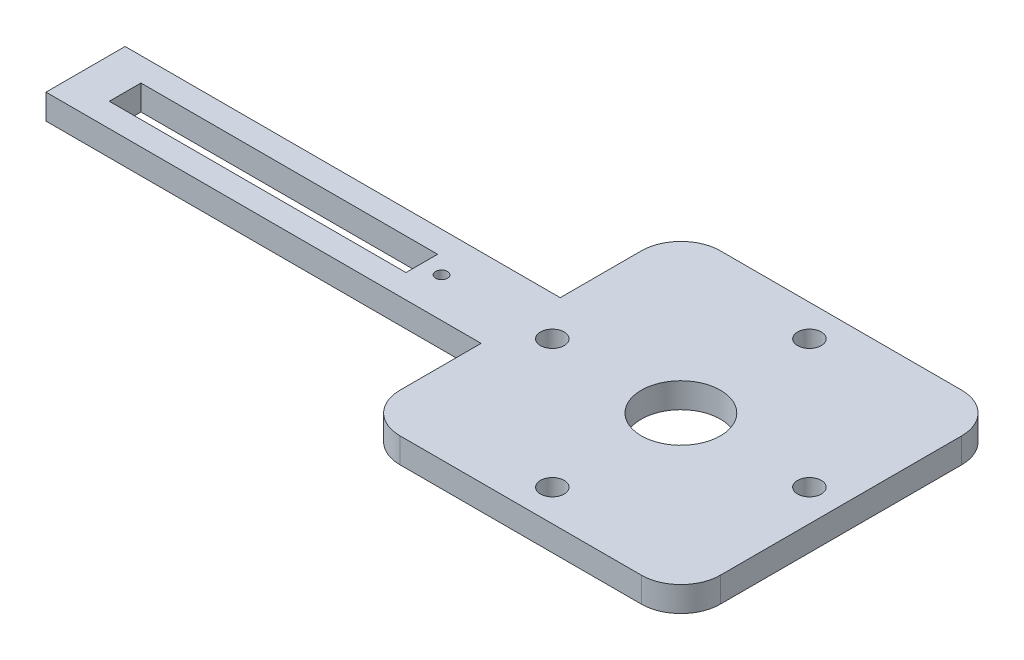
ISO-10303-21;
HEADER;
FILE_DESCRIPTION(('STEP AP214'),'2;1');
FILE_NAME('part.step','',(''),(''),'','','');
FILE_SCHEMA(('AUTOMOTIVE_DESIGN { 1 0 10303 214 1 1 1 1 }'));
ENDSEC;
DATA;
#1=APPLICATION_CONTEXT('core data for automotive mechanical design processes');
#2=APPLICATION_PROTOCOL_DEFINITION('international standard','automotive_design',2000,#1);
#3=PRODUCT_CONTEXT('',#1,'mechanical');
#4=PRODUCT('Part','Part','',(#3));
#5=PRODUCT_RELATED_PRODUCT_CATEGORY('part','',(#4));
#6=PRODUCT_DEFINITION_FORMATION('','',#4);
#7=PRODUCT_DEFINITION_CONTEXT('part definition',#1,'design');
#8=PRODUCT_DEFINITION('design','',#6,#7);
#9=PRODUCT_DEFINITION_SHAPE('','',#8);
#10=(LENGTH_UNIT() NAMED_UNIT(*) SI_UNIT(.MILLI.,.METRE.));
#11=(NAMED_UNIT(*) PLANE_ANGLE_UNIT() SI_UNIT($,.RADIAN.));
#12=(NAMED_UNIT(*) SI_UNIT($,.STERADIAN.) SOLID_ANGLE_UNIT());
#13=UNCERTAINTY_MEASURE_WITH_UNIT(LENGTH_MEASURE(1.E-05),#10,'distance_accuracy_value','');
#14=(GEOMETRIC_REPRESENTATION_CONTEXT(3) GLOBAL_UNCERTAINTY_ASSIGNED_CONTEXT((#13)) GLOBAL_UNIT_ASSIGNED_CONTEXT((#10,
#11,#12)) REPRESENTATION_CONTEXT('',''));
#15=CARTESIAN_POINT('',(0.,0.,0.));
#16=DIRECTION('',(0.,0.,1.));
#17=DIRECTION('',(1.,0.,0.));
#18=AXIS2_PLACEMENT_3D('',#15,#16,#17);
#19=CARTESIAN_POINT('',(0.,6.35,0.));
#20=DIRECTION('',(0.,1.,0.));
#21=DIRECTION('',(0.,0.,1.));
#22=AXIS2_PLACEMENT_3D('',#19,#20,#21);
#23=PLANE('',#22);
#24=DIRECTION('',(0.,0.,1.));
#25=VECTOR('',#24,1.);
#26=CARTESIAN_POINT('',(-140.5,6.35,-3.99999999999999));
#27=LINE('',#26,#25);
#28=CARTESIAN_POINT('',(-140.5,6.35,-3.99999999999999));
#29=VERTEX_POINT('',#28);
#30=CARTESIAN_POINT('',(-140.5,6.35,4.00000000000001));
#31=VERTEX_POINT('',#30);
#32=EDGE_CURVE('E157',#29,#31,#27,.T.);
#33=ORIENTED_EDGE('',*,*,#32,.F.);
#34=DIRECTION('',(-1.,0.,0.));
#35=VECTOR('',#34,1.);
#36=CARTESIAN_POINT('',(-65.5,6.35,-4.00000000000001));
#37=LINE('',#36,#35);
#38=CARTESIAN_POINT('',(-65.5,6.35,-4.00000000000001));
#39=VERTEX_POINT('',#38);
#40=EDGE_CURVE('E147',#39,#29,#37,.T.);
#41=ORIENTED_EDGE('',*,*,#40,.F.);
#42=DIRECTION('',(0.,0.,-1.));
#43=VECTOR('',#42,1.);
#44=CARTESIAN_POINT('',(-65.5,6.35,3.99999999999999));
#45=LINE('',#44,#43);
#46=CARTESIAN_POINT('',(-65.5,6.35,3.99999999999999));
#47=VERTEX_POINT('',#46);
#48=EDGE_CURVE('E173',#47,#39,#45,.T.);
#49=ORIENTED_EDGE('',*,*,#48,.F.);
#50=DIRECTION('',(1.,0.,0.));
#51=VECTOR('',#50,1.);
#52=CARTESIAN_POINT('',(-140.5,6.35,4.00000000000001));
#53=LINE('',#52,#51);
#54=EDGE_CURVE('E171',#31,#47,#53,.T.);
#55=ORIENTED_EDGE('',*,*,#54,.F.);
#56=EDGE_LOOP('',(#33,#41,#49,#55));
#57=FACE_BOUND('',#56,.T.);
#58=CARTESIAN_POINT('',(32.5,6.35,0.));
#59=DIRECTION('',(0.,1.,0.));
#60=DIRECTION('',(0.,0.,1.));
#61=AXIS2_PLACEMENT_3D('',#58,#59,#60);
#62=CIRCLE('',#61,3.);
#63=CARTESIAN_POINT('',(32.5,6.35,3.));
#64=VERTEX_POINT('',#63);
#65=EDGE_CURVE('E191',#64,#64,#62,.T.);
#66=ORIENTED_EDGE('',*,*,#65,.F.);
#67=EDGE_LOOP('',(#66));
#68=FACE_BOUND('',#67,.T.);
#69=CARTESIAN_POINT('',(-32.5,6.35,0.));
#70=DIRECTION('',(0.,1.,0.));
#71=DIRECTION('',(0.,0.,1.));
#72=AXIS2_PLACEMENT_3D('',#69,#70,#71);
#73=CIRCLE('',#72,3.);
#74=CARTESIAN_POINT('',(-32.5,6.35,3.));
#75=VERTEX_POINT('',#74);
#76=EDGE_CURVE('E203',#75,#75,#73,.T.);
#77=ORIENTED_EDGE('',*,*,#76,.F.);
#78=EDGE_LOOP('',(#77));
#79=FACE_BOUND('',#78,.T.);
#80=CARTESIAN_POINT('',(0.,6.35,0.));
#81=DIRECTION('',(0.,1.,0.));
#82=DIRECTION('',(0.,0.,1.));
#83=AXIS2_PLACEMENT_3D('',#80,#81,#82);
#84=CIRCLE('',#83,10.);
#85=CARTESIAN_POINT('',(0.,6.35,10.));
#86=VERTEX_POINT('',#85);
#87=EDGE_CURVE('E215',#86,#86,#84,.T.);
#88=ORIENTED_EDGE('',*,*,#87,.F.);
#89=EDGE_LOOP('',(#88));
#90=FACE_BOUND('',#89,.T.);
#91=DIRECTION('',(-1.,0.,0.));
#92=VECTOR('',#91,1.);
#93=CARTESIAN_POINT('',(-40.5,6.35,-40.5));
#94=LINE('',#93,#92);
#95=CARTESIAN_POINT('',(30.5,6.35,-40.5));
#96=VERTEX_POINT('',#95);
#97=CARTESIAN_POINT('',(-30.5,6.35,-40.5));
#98=VERTEX_POINT('',#97);
#99=EDGE_CURVE('E224',#96,#98,#94,.T.);
#100=ORIENTED_EDGE('',*,*,#99,.T.);
#101=CARTESIAN_POINT('',(-30.5,6.35,-30.5));
#102=DIRECTION('',(0.,1.,0.));
#103=DIRECTION('',(0.,0.,1.));
#104=AXIS2_PLACEMENT_3D('',#101,#102,#103);
#105=CIRCLE('',#104,10.);
#106=CARTESIAN_POINT('',(-40.5,6.35,-30.5));
#107=VERTEX_POINT('',#106);
#108=EDGE_CURVE('E291',#98,#107,#105,.T.);
#109=ORIENTED_EDGE('',*,*,#108,.T.);
#110=DIRECTION('',(0.,0.,1.));
#111=VECTOR('',#110,1.);
#112=CARTESIAN_POINT('',(-40.5,6.35,-40.5));
#113=LINE('',#112,#111);
#114=CARTESIAN_POINT('',(-40.5,6.35,-10.));
#115=VERTEX_POINT('',#114);
#116=EDGE_CURVE('E228',#107,#115,#113,.T.);
#117=ORIENTED_EDGE('',*,*,#116,.T.);
#118=DIRECTION('',(-1.,0.,0.));
#119=VECTOR('',#118,1.);
#120=CARTESIAN_POINT('',(-40.5,6.35,-10.));
#121=LINE('',#120,#119);
#122=CARTESIAN_POINT('',(-150.5,6.35,-9.99999999999999));
#123=VERTEX_POINT('',#122);
#124=EDGE_CURVE('E230',#115,#123,#121,.T.);
#125=ORIENTED_EDGE('',*,*,#124,.T.);
#126=DIRECTION('',(0.,0.,1.));
#127=VECTOR('',#126,1.);
#128=CARTESIAN_POINT('',(-150.5,6.35,-9.99999999999999));
#129=LINE('',#128,#127);
#130=CARTESIAN_POINT('',(-150.5,6.35,9.99999999999999));
#131=VERTEX_POINT('',#130);
#132=EDGE_CURVE('E232',#123,#131,#129,.T.);
#133=ORIENTED_EDGE('',*,*,#132,.T.);
#134=DIRECTION('',(1.,0.,0.));
#135=VECTOR('',#134,1.);
#136=CARTESIAN_POINT('',(-150.5,6.35,9.99999999999999));
#137=LINE('',#136,#135);
#138=CARTESIAN_POINT('',(-40.5,6.35,10.));
#139=VERTEX_POINT('',#138);
#140=EDGE_CURVE('E234',#131,#139,#137,.T.);
#141=ORIENTED_EDGE('',*,*,#140,.T.);
#142=DIRECTION('',(0.,0.,1.));
#143=VECTOR('',#142,1.);
#144=CARTESIAN_POINT('',(-40.5,6.35,10.));
#145=LINE('',#144,#143);
#146=CARTESIAN_POINT('',(-40.5,6.35,30.5));
#147=VERTEX_POINT('',#146);
#148=EDGE_CURVE('E236',#139,#147,#145,.T.);
#149=ORIENTED_EDGE('',*,*,#148,.T.);
#150=CARTESIAN_POINT('',(-30.5,6.35,30.5));
#151=DIRECTION('',(0.,1.,0.));
#152=DIRECTION('',(0.,0.,1.));
#153=AXIS2_PLACEMENT_3D('',#150,#151,#152);
#154=CIRCLE('',#153,10.);
#155=CARTESIAN_POINT('',(-30.5,6.35,40.5));
#156=VERTEX_POINT('',#155);
#157=EDGE_CURVE('E54',#147,#156,#154,.T.);
#158=ORIENTED_EDGE('',*,*,#157,.T.);
#159=DIRECTION('',(1.,0.,0.));
#160=VECTOR('',#159,1.);
#161=CARTESIAN_POINT('',(-40.5,6.35,40.5));
#162=LINE('',#161,#160);
#163=CARTESIAN_POINT('',(30.5,6.35,40.5));
#164=VERTEX_POINT('',#163);
#165=EDGE_CURVE('E238',#156,#164,#162,.T.);
#166=ORIENTED_EDGE('',*,*,#165,.T.);
#167=CARTESIAN_POINT('',(30.5,6.35,30.5));
#168=DIRECTION('',(0.,1.,0.));
#169=DIRECTION('',(0.,0.,1.));
#170=AXIS2_PLACEMENT_3D('',#167,#168,#169);
#171=CIRCLE('',#170,10.);
#172=CARTESIAN_POINT('',(40.5,6.35,30.5));
#173=VERTEX_POINT('',#172);
#174=EDGE_CURVE('E287',#164,#173,#171,.T.);
#175=ORIENTED_EDGE('',*,*,#174,.T.);
#176=DIRECTION('',(0.,0.,-1.));
#177=VECTOR('',#176,1.);
#178=CARTESIAN_POINT('',(40.5,6.35,-40.5));
#179=LINE('',#178,#177);
#180=CARTESIAN_POINT('',(40.5,6.35,-30.5));
#181=VERTEX_POINT('',#180);
#182=EDGE_CURVE('E221',#173,#181,#179,.T.);
#183=ORIENTED_EDGE('',*,*,#182,.T.);
#184=CARTESIAN_POINT('',(30.5,6.35,-30.5));
#185=DIRECTION('',(0.,1.,0.));
#186=DIRECTION('',(0.,0.,1.));
#187=AXIS2_PLACEMENT_3D('',#184,#185,#186);
#188=CIRCLE('',#187,10.);
#189=EDGE_CURVE('E289',#181,#96,#188,.T.);
#190=ORIENTED_EDGE('',*,*,#189,.T.);
#191=EDGE_LOOP('',(#100,#109,#117,#125,#133,#141,#149,#158,#166,#175,#183,#190));
#192=FACE_BOUND('',#191,.T.);
#193=CARTESIAN_POINT('',(0.,6.35,-32.5));
#194=DIRECTION('',(0.,1.,0.));
#195=DIRECTION('',(0.,0.,1.));
#196=AXIS2_PLACEMENT_3D('',#193,#194,#195);
#197=CIRCLE('',#196,3.);
#198=CARTESIAN_POINT('',(0.,6.35,-29.5));
#199=VERTEX_POINT('',#198);
#200=EDGE_CURVE('E209',#199,#199,#197,.T.);
#201=ORIENTED_EDGE('',*,*,#200,.F.);
#202=EDGE_LOOP('',(#201));
#203=FACE_BOUND('',#202,.T.);
#204=CARTESIAN_POINT('',(0.,6.35,32.5));
#205=DIRECTION('',(0.,1.,0.));
#206=DIRECTION('',(0.,0.,1.));
#207=AXIS2_PLACEMENT_3D('',#204,#205,#206);
#208=CIRCLE('',#207,3.);
#209=CARTESIAN_POINT('',(0.,6.35,35.5));
#210=VERTEX_POINT('',#209);
#211=EDGE_CURVE('E197',#210,#210,#208,.T.);
#212=ORIENTED_EDGE('',*,*,#211,.F.);
#213=EDGE_LOOP('',(#212));
#214=FACE_BOUND('',#213,.T.);
#215=CARTESIAN_POINT('',(-60.5,6.35,0.));
#216=DIRECTION('',(0.,1.,0.));
#217=DIRECTION('',(0.,0.,1.));
#218=AXIS2_PLACEMENT_3D('',#215,#216,#217);
#219=CIRCLE('',#218,1.5);
#220=CARTESIAN_POINT('',(-60.5,6.35,1.50000000000001));
#221=VERTEX_POINT('',#220);
#222=EDGE_CURVE('E180',#221,#221,#219,.T.);
#223=ORIENTED_EDGE('',*,*,#222,.F.);
#224=EDGE_LOOP('',(#223));
#225=FACE_BOUND('',#224,.T.);
#226=ADVANCED_FACE('F33',(#57,#68,#79,#90,#192,#203,#214,#225),#23,.T.);
#227=CARTESIAN_POINT('',(0.,0.,0.));
#228=DIRECTION('',(0.,1.,0.));
#229=DIRECTION('',(0.,0.,1.));
#230=AXIS2_PLACEMENT_3D('',#227,#228,#229);
#231=PLANE('',#230);
#232=CARTESIAN_POINT('',(32.5,0.,0.));
#233=DIRECTION('',(0.,1.,0.));
#234=DIRECTION('',(0.,0.,1.));
#235=AXIS2_PLACEMENT_3D('',#232,#233,#234);
#236=CIRCLE('',#235,3.);
#237=CARTESIAN_POINT('',(32.5,0.,3.));
#238=VERTEX_POINT('',#237);
#239=EDGE_CURVE('E165',#238,#238,#236,.T.);
#240=ORIENTED_EDGE('',*,*,#239,.T.);
#241=EDGE_LOOP('',(#240));
#242=FACE_BOUND('',#241,.T.);
#243=CARTESIAN_POINT('',(0.,0.,32.5));
#244=DIRECTION('',(0.,1.,0.));
#245=DIRECTION('',(0.,0.,1.));
#246=AXIS2_PLACEMENT_3D('',#243,#244,#245);
#247=CIRCLE('',#246,3.);
#248=CARTESIAN_POINT('',(0.,0.,35.5));
#249=VERTEX_POINT('',#248);
#250=EDGE_CURVE('E194',#249,#249,#247,.T.);
#251=ORIENTED_EDGE('',*,*,#250,.T.);
#252=EDGE_LOOP('',(#251));
#253=FACE_BOUND('',#252,.T.);
#254=CARTESIAN_POINT('',(-32.5,0.,0.));
#255=DIRECTION('',(0.,1.,0.));
#256=DIRECTION('',(0.,0.,1.));
#257=AXIS2_PLACEMENT_3D('',#254,#255,#256);
#258=CIRCLE('',#257,3.);
#259=CARTESIAN_POINT('',(-32.5,0.,3.));
#260=VERTEX_POINT('',#259);
#261=EDGE_CURVE('E200',#260,#260,#258,.T.);
#262=ORIENTED_EDGE('',*,*,#261,.T.);
#263=EDGE_LOOP('',(#262));
#264=FACE_BOUND('',#263,.T.);
#265=CARTESIAN_POINT('',(0.,0.,-32.5));
#266=DIRECTION('',(0.,1.,0.));
#267=DIRECTION('',(0.,0.,1.));
#268=AXIS2_PLACEMENT_3D('',#265,#266,#267);
#269=CIRCLE('',#268,3.);
#270=CARTESIAN_POINT('',(0.,0.,-29.5));
#271=VERTEX_POINT('',#270);
#272=EDGE_CURVE('E206',#271,#271,#269,.T.);
#273=ORIENTED_EDGE('',*,*,#272,.T.);
#274=EDGE_LOOP('',(#273));
#275=FACE_BOUND('',#274,.T.);
#276=CARTESIAN_POINT('',(0.,0.,0.));
#277=DIRECTION('',(0.,1.,0.));
#278=DIRECTION('',(0.,0.,1.));
#279=AXIS2_PLACEMENT_3D('',#276,#277,#278);
#280=CIRCLE('',#279,10.);
#281=CARTESIAN_POINT('',(0.,0.,10.));
#282=VERTEX_POINT('',#281);
#283=EDGE_CURVE('E212',#282,#282,#280,.T.);
#284=ORIENTED_EDGE('',*,*,#283,.T.);
#285=EDGE_LOOP('',(#284));
#286=FACE_BOUND('',#285,.T.);
#287=DIRECTION('',(0.,0.,1.));
#288=VECTOR('',#287,1.);
#289=CARTESIAN_POINT('',(-40.5,0.,-40.5));
#290=LINE('',#289,#288);
#291=CARTESIAN_POINT('',(-40.5,0.,-30.5));
#292=VERTEX_POINT('',#291);
#293=CARTESIAN_POINT('',(-40.5,0.,-10.));
#294=VERTEX_POINT('',#293);
#295=EDGE_CURVE('E246',#292,#294,#290,.T.);
#296=ORIENTED_EDGE('',*,*,#295,.F.);
#297=CARTESIAN_POINT('',(-30.5,0.,-30.5));
#298=DIRECTION('',(0.,1.,0.));
#299=DIRECTION('',(0.,0.,1.));
#300=AXIS2_PLACEMENT_3D('',#297,#298,#299);
#301=CIRCLE('',#300,10.);
#302=CARTESIAN_POINT('',(-30.5,0.,-40.5));
#303=VERTEX_POINT('',#302);
#304=EDGE_CURVE('E279',#292,#303,#301,.F.);
#305=ORIENTED_EDGE('',*,*,#304,.T.);
#306=DIRECTION('',(-1.,0.,0.));
#307=VECTOR('',#306,1.);
#308=CARTESIAN_POINT('',(-40.5,0.,-40.5));
#309=LINE('',#308,#307);
#310=CARTESIAN_POINT('',(30.5,0.,-40.5));
#311=VERTEX_POINT('',#310);
#312=EDGE_CURVE('E243',#311,#303,#309,.T.);
#313=ORIENTED_EDGE('',*,*,#312,.F.);
#314=CARTESIAN_POINT('',(30.5,0.,-30.5));
#315=DIRECTION('',(0.,1.,0.));
#316=DIRECTION('',(0.,0.,1.));
#317=AXIS2_PLACEMENT_3D('',#314,#315,#316);
#318=CIRCLE('',#317,10.);
#319=CARTESIAN_POINT('',(40.5,0.,-30.5));
#320=VERTEX_POINT('',#319);
#321=EDGE_CURVE('E277',#311,#320,#318,.F.);
#322=ORIENTED_EDGE('',*,*,#321,.T.);
#323=DIRECTION('',(0.,0.,-1.));
#324=VECTOR('',#323,1.);
#325=CARTESIAN_POINT('',(40.5,0.,-40.5));
#326=LINE('',#325,#324);
#327=CARTESIAN_POINT('',(40.5,0.,30.5));
#328=VERTEX_POINT('',#327);
#329=EDGE_CURVE('E218',#328,#320,#326,.T.);
#330=ORIENTED_EDGE('',*,*,#329,.F.);
#331=CARTESIAN_POINT('',(30.5,0.,30.5));
#332=DIRECTION('',(0.,1.,0.));
#333=DIRECTION('',(0.,0.,1.));
#334=AXIS2_PLACEMENT_3D('',#331,#332,#333);
#335=CIRCLE('',#334,10.);
#336=CARTESIAN_POINT('',(30.5,0.,40.5));
#337=VERTEX_POINT('',#336);
#338=EDGE_CURVE('E275',#328,#337,#335,.F.);
#339=ORIENTED_EDGE('',*,*,#338,.T.);
#340=DIRECTION('',(1.,0.,0.));
#341=VECTOR('',#340,1.);
#342=CARTESIAN_POINT('',(-40.5,0.,40.5));
#343=LINE('',#342,#341);
#344=CARTESIAN_POINT('',(-30.5,0.,40.5));
#345=VERTEX_POINT('',#344);
#346=EDGE_CURVE('E225',#345,#337,#343,.T.);
#347=ORIENTED_EDGE('',*,*,#346,.F.);
#348=CARTESIAN_POINT('',(-30.5,0.,30.5));
#349=DIRECTION('',(0.,1.,0.));
#350=DIRECTION('',(0.,0.,1.));
#351=AXIS2_PLACEMENT_3D('',#348,#349,#350);
#352=CIRCLE('',#351,10.);
#353=CARTESIAN_POINT('',(-40.5,0.,30.5));
#354=VERTEX_POINT('',#353);
#355=EDGE_CURVE('E273',#345,#354,#352,.F.);
#356=ORIENTED_EDGE('',*,*,#355,.T.);
#357=DIRECTION('',(0.,0.,1.));
#358=VECTOR('',#357,1.);
#359=CARTESIAN_POINT('',(-40.5,0.,10.));
#360=LINE('',#359,#358);
#361=CARTESIAN_POINT('',(-40.5,0.,10.));
#362=VERTEX_POINT('',#361);
#363=EDGE_CURVE('E255',#362,#354,#360,.T.);
#364=ORIENTED_EDGE('',*,*,#363,.F.);
#365=DIRECTION('',(1.,0.,0.));
#366=VECTOR('',#365,1.);
#367=CARTESIAN_POINT('',(-40.5,0.,10.));
#368=LINE('',#367,#366);
#369=CARTESIAN_POINT('',(-150.5,0.,9.99999999999999));
#370=VERTEX_POINT('',#369);
#371=EDGE_CURVE('E253',#370,#362,#368,.T.);
#372=ORIENTED_EDGE('',*,*,#371,.F.);
#373=DIRECTION('',(0.,0.,1.));
#374=VECTOR('',#373,1.);
#375=CARTESIAN_POINT('',(-150.5,0.,-9.99999999999999));
#376=LINE('',#375,#374);
#377=CARTESIAN_POINT('',(-150.5,0.,-9.99999999999999));
#378=VERTEX_POINT('',#377);
#379=EDGE_CURVE('E250',#378,#370,#376,.T.);
#380=ORIENTED_EDGE('',*,*,#379,.F.);
#381=DIRECTION('',(-1.,0.,0.));
#382=VECTOR('',#381,1.);
#383=CARTESIAN_POINT('',(-140.5,0.,-9.99999999999999));
#384=LINE('',#383,#382);
#385=EDGE_CURVE('E248',#294,#378,#384,.T.);
#386=ORIENTED_EDGE('',*,*,#385,.F.);
#387=EDGE_LOOP('',(#296,#305,#313,#322,#330,#339,#347,#356,#364,#372,#380,#386));
#388=FACE_BOUND('',#387,.T.);
#389=DIRECTION('',(-1.,0.,0.));
#390=VECTOR('',#389,1.);
#391=CARTESIAN_POINT('',(-65.5,0.,-4.00000000000001));
#392=LINE('',#391,#390);
#393=CARTESIAN_POINT('',(-65.5,0.,-4.00000000000001));
#394=VERTEX_POINT('',#393);
#395=CARTESIAN_POINT('',(-140.5,0.,-3.99999999999999));
#396=VERTEX_POINT('',#395);
#397=EDGE_CURVE('E178',#394,#396,#392,.T.);
#398=ORIENTED_EDGE('',*,*,#397,.T.);
#399=DIRECTION('',(0.,0.,1.));
#400=VECTOR('',#399,1.);
#401=CARTESIAN_POINT('',(-140.5,0.,-3.99999999999999));
#402=LINE('',#401,#400);
#403=CARTESIAN_POINT('',(-140.5,0.,4.00000000000001));
#404=VERTEX_POINT('',#403);
#405=EDGE_CURVE('E164',#396,#404,#402,.T.);
#406=ORIENTED_EDGE('',*,*,#405,.T.);
#407=DIRECTION('',(1.,0.,0.));
#408=VECTOR('',#407,1.);
#409=CARTESIAN_POINT('',(-140.5,0.,4.00000000000001));
#410=LINE('',#409,#408);
#411=CARTESIAN_POINT('',(-65.5,0.,3.99999999999999));
#412=VERTEX_POINT('',#411);
#413=EDGE_CURVE('E182',#404,#412,#410,.T.);
#414=ORIENTED_EDGE('',*,*,#413,.T.);
#415=DIRECTION('',(0.,0.,-1.));
#416=VECTOR('',#415,1.);
#417=CARTESIAN_POINT('',(-65.5,0.,3.99999999999999));
#418=LINE('',#417,#416);
#419=EDGE_CURVE('E158',#412,#394,#418,.T.);
#420=ORIENTED_EDGE('',*,*,#419,.T.);
#421=EDGE_LOOP('',(#398,#406,#414,#420));
#422=FACE_BOUND('',#421,.T.);
#423=CARTESIAN_POINT('',(-60.5,0.,0.));
#424=DIRECTION('',(0.,1.,0.));
#425=DIRECTION('',(0.,0.,1.));
#426=AXIS2_PLACEMENT_3D('',#423,#424,#425);
#427=CIRCLE('',#426,1.5);
#428=CARTESIAN_POINT('',(-60.5,0.,1.50000000000001));
#429=VERTEX_POINT('',#428);
#430=EDGE_CURVE('E414',#429,#429,#427,.T.);
#431=ORIENTED_EDGE('',*,*,#430,.T.);
#432=EDGE_LOOP('',(#431));
#433=FACE_BOUND('',#432,.T.);
#434=ADVANCED_FACE('F306',(#242,#253,#264,#275,#286,#388,#422,#433),#231,.F.);
#435=CARTESIAN_POINT('',(40.5,6.35,-40.5));
#436=DIRECTION('',(-1.,0.,0.));
#437=DIRECTION('',(0.,0.,1.));
#438=AXIS2_PLACEMENT_3D('',#435,#436,#437);
#439=PLANE('',#438);
#440=ORIENTED_EDGE('',*,*,#329,.T.);
#441=DIRECTION('',(0.,-1.,0.));
#442=VECTOR('',#441,1.);
#443=CARTESIAN_POINT('',(40.5,6.35,-30.5));
#444=LINE('',#443,#442);
#445=EDGE_CURVE('E296',#320,#181,#444,.F.);
#446=ORIENTED_EDGE('',*,*,#445,.T.);
#447=ORIENTED_EDGE('',*,*,#182,.F.);
#448=DIRECTION('',(0.,-1.,0.));
#449=VECTOR('',#448,1.);
#450=CARTESIAN_POINT('',(40.5,6.35,30.5));
#451=LINE('',#450,#449);
#452=EDGE_CURVE('E293',#173,#328,#451,.T.);
#453=ORIENTED_EDGE('',*,*,#452,.T.);
#454=EDGE_LOOP('',(#440,#446,#447,#453));
#455=FACE_BOUND('',#454,.T.);
#456=ADVANCED_FACE('F316',(#455),#439,.F.);
#457=CARTESIAN_POINT('',(-40.5,6.35,-40.5));
#458=DIRECTION('',(0.,0.,1.));
#459=DIRECTION('',(1.,0.,0.));
#460=AXIS2_PLACEMENT_3D('',#457,#458,#459);
#461=PLANE('',#460);
#462=ORIENTED_EDGE('',*,*,#312,.T.);
#463=DIRECTION('',(0.,-1.,0.));
#464=VECTOR('',#463,1.);
#465=CARTESIAN_POINT('',(-30.5,6.35,-40.5));
#466=LINE('',#465,#464);
#467=EDGE_CURVE('E284',#303,#98,#466,.F.);
#468=ORIENTED_EDGE('',*,*,#467,.T.);
#469=ORIENTED_EDGE('',*,*,#99,.F.);
#470=DIRECTION('',(0.,-1.,0.));
#471=VECTOR('',#470,1.);
#472=CARTESIAN_POINT('',(30.5,6.35,-40.5));
#473=LINE('',#472,#471);
#474=EDGE_CURVE('E281',#96,#311,#473,.T.);
#475=ORIENTED_EDGE('',*,*,#474,.T.);
#476=EDGE_LOOP('',(#462,#468,#469,#475));
#477=FACE_BOUND('',#476,.T.);
#478=ADVANCED_FACE('F326',(#477),#461,.F.);
#479=CARTESIAN_POINT('',(-40.5,6.35,-40.5));
#480=DIRECTION('',(1.,0.,0.));
#481=DIRECTION('',(0.,0.,-1.));
#482=AXIS2_PLACEMENT_3D('',#479,#480,#481);
#483=PLANE('',#482);
#484=ORIENTED_EDGE('',*,*,#116,.F.);
#485=DIRECTION('',(0.,-1.,0.));
#486=VECTOR('',#485,1.);
#487=CARTESIAN_POINT('',(-40.5,6.35,-30.5));
#488=LINE('',#487,#486);
#489=EDGE_CURVE('E270',#107,#292,#488,.T.);
#490=ORIENTED_EDGE('',*,*,#489,.T.);
#491=ORIENTED_EDGE('',*,*,#295,.T.);
#492=DIRECTION('',(0.,-1.,0.));
#493=VECTOR('',#492,1.);
#494=CARTESIAN_POINT('',(-40.5,6.35,-10.));
#495=LINE('',#494,#493);
#496=EDGE_CURVE('E267',#115,#294,#495,.T.);
#497=ORIENTED_EDGE('',*,*,#496,.F.);
#498=EDGE_LOOP('',(#484,#490,#491,#497));
#499=FACE_BOUND('',#498,.T.);
#500=ADVANCED_FACE('F335',(#499),#483,.F.);
#501=CARTESIAN_POINT('',(-140.5,6.35,-9.99999999999999));
#502=DIRECTION('',(0.,0.,1.));
#503=DIRECTION('',(1.,0.,0.));
#504=AXIS2_PLACEMENT_3D('',#501,#502,#503);
#505=PLANE('',#504);
#506=ORIENTED_EDGE('',*,*,#385,.T.);
#507=DIRECTION('',(0.,-1.,0.));
#508=VECTOR('',#507,1.);
#509=CARTESIAN_POINT('',(-150.5,6.35,-9.99999999999999));
#510=LINE('',#509,#508);
#511=EDGE_CURVE('E264',#123,#378,#510,.T.);
#512=ORIENTED_EDGE('',*,*,#511,.F.);
#513=ORIENTED_EDGE('',*,*,#124,.F.);
#514=ORIENTED_EDGE('',*,*,#496,.T.);
#515=EDGE_LOOP('',(#506,#512,#513,#514));
#516=FACE_BOUND('',#515,.T.);
#517=ADVANCED_FACE('F342',(#516),#505,.F.);
#518=CARTESIAN_POINT('',(-150.5,6.35,-9.99999999999999));
#519=DIRECTION('',(1.,0.,0.));
#520=DIRECTION('',(0.,0.,-1.));
#521=AXIS2_PLACEMENT_3D('',#518,#519,#520);
#522=PLANE('',#521);
#523=ORIENTED_EDGE('',*,*,#379,.T.);
#524=DIRECTION('',(0.,-1.,0.));
#525=VECTOR('',#524,1.);
#526=CARTESIAN_POINT('',(-150.5,6.35,9.99999999999999));
#527=LINE('',#526,#525);
#528=EDGE_CURVE('E261',#131,#370,#527,.T.);
#529=ORIENTED_EDGE('',*,*,#528,.F.);
#530=ORIENTED_EDGE('',*,*,#132,.F.);
#531=ORIENTED_EDGE('',*,*,#511,.T.);
#532=EDGE_LOOP('',(#523,#529,#530,#531));
#533=FACE_BOUND('',#532,.T.);
#534=ADVANCED_FACE('F345',(#533),#522,.F.);
#535=CARTESIAN_POINT('',(-40.5,6.35,10.));
#536=DIRECTION('',(0.,0.,-1.));
#537=DIRECTION('',(-1.,0.,0.));
#538=AXIS2_PLACEMENT_3D('',#535,#536,#537);
#539=PLANE('',#538);
#540=ORIENTED_EDGE('',*,*,#371,.T.);
#541=DIRECTION('',(0.,-1.,0.));
#542=VECTOR('',#541,1.);
#543=CARTESIAN_POINT('',(-40.5,6.35,10.));
#544=LINE('',#543,#542);
#545=EDGE_CURVE('E240',#139,#362,#544,.T.);
#546=ORIENTED_EDGE('',*,*,#545,.F.);
#547=ORIENTED_EDGE('',*,*,#140,.F.);
#548=ORIENTED_EDGE('',*,*,#528,.T.);
#549=EDGE_LOOP('',(#540,#546,#547,#548));
#550=FACE_BOUND('',#549,.T.);
#551=ADVANCED_FACE('F349',(#550),#539,.F.);
#552=CARTESIAN_POINT('',(-40.5,6.35,10.));
#553=DIRECTION('',(1.,0.,0.));
#554=DIRECTION('',(0.,0.,-1.));
#555=AXIS2_PLACEMENT_3D('',#552,#553,#554);
#556=PLANE('',#555);
#557=ORIENTED_EDGE('',*,*,#363,.T.);
#558=DIRECTION('',(0.,-1.,0.));
#559=VECTOR('',#558,1.);
#560=CARTESIAN_POINT('',(-40.5,6.35,30.5));
#561=LINE('',#560,#559);
#562=EDGE_CURVE('E11',#354,#147,#561,.F.);
#563=ORIENTED_EDGE('',*,*,#562,.T.);
#564=ORIENTED_EDGE('',*,*,#148,.F.);
#565=ORIENTED_EDGE('',*,*,#545,.T.);
#566=EDGE_LOOP('',(#557,#563,#564,#565));
#567=FACE_BOUND('',#566,.T.);
#568=ADVANCED_FACE('F353',(#567),#556,.F.);
#569=CARTESIAN_POINT('',(-40.5,6.35,40.5));
#570=DIRECTION('',(0.,0.,-1.));
#571=DIRECTION('',(-1.,0.,0.));
#572=AXIS2_PLACEMENT_3D('',#569,#570,#571);
#573=PLANE('',#572);
#574=ORIENTED_EDGE('',*,*,#346,.T.);
#575=DIRECTION('',(0.,-1.,0.));
#576=VECTOR('',#575,1.);
#577=CARTESIAN_POINT('',(30.5,6.35,40.5));
#578=LINE('',#577,#576);
#579=EDGE_CURVE('E41',#337,#164,#578,.F.);
#580=ORIENTED_EDGE('',*,*,#579,.T.);
#581=ORIENTED_EDGE('',*,*,#165,.F.);
#582=DIRECTION('',(0.,-1.,0.));
#583=VECTOR('',#582,1.);
#584=CARTESIAN_POINT('',(-30.5,6.35,40.5));
#585=LINE('',#584,#583);
#586=EDGE_CURVE('E298',#156,#345,#585,.T.);
#587=ORIENTED_EDGE('',*,*,#586,.T.);
#588=EDGE_LOOP('',(#574,#580,#581,#587));
#589=FACE_BOUND('',#588,.T.);
#590=ADVANCED_FACE('F302',(#589),#573,.F.);
#591=CARTESIAN_POINT('',(0.,6.35,0.));
#592=DIRECTION('',(0.,-1.,0.));
#593=DIRECTION('',(0.,0.,-1.));
#594=AXIS2_PLACEMENT_3D('',#591,#592,#593);
#595=CYLINDRICAL_SURFACE('',#594,10.);
#596=ORIENTED_EDGE('',*,*,#87,.T.);
#597=EDGE_LOOP('',(#596));
#598=FACE_BOUND('',#597,.T.);
#599=ORIENTED_EDGE('',*,*,#283,.F.);
#600=EDGE_LOOP('',(#599));
#601=FACE_BOUND('',#600,.T.);
#602=ADVANCED_FACE('F360',(#598,#601),#595,.F.);
#603=CARTESIAN_POINT('',(0.,6.35,-32.5));
#604=DIRECTION('',(0.,-1.,0.));
#605=DIRECTION('',(0.,0.,-1.));
#606=AXIS2_PLACEMENT_3D('',#603,#604,#605);
#607=CYLINDRICAL_SURFACE('',#606,3.);
#608=ORIENTED_EDGE('',*,*,#200,.T.);
#609=EDGE_LOOP('',(#608));
#610=FACE_BOUND('',#609,.T.);
#611=ORIENTED_EDGE('',*,*,#272,.F.);
#612=EDGE_LOOP('',(#611));
#613=FACE_BOUND('',#612,.T.);
#614=ADVANCED_FACE('F373',(#610,#613),#607,.F.);
#615=CARTESIAN_POINT('',(-32.5,6.35,0.));
#616=DIRECTION('',(0.,-1.,0.));
#617=DIRECTION('',(0.,0.,-1.));
#618=AXIS2_PLACEMENT_3D('',#615,#616,#617);
#619=CYLINDRICAL_SURFACE('',#618,3.);
#620=ORIENTED_EDGE('',*,*,#76,.T.);
#621=EDGE_LOOP('',(#620));
#622=FACE_BOUND('',#621,.T.);
#623=ORIENTED_EDGE('',*,*,#261,.F.);
#624=EDGE_LOOP('',(#623));
#625=FACE_BOUND('',#624,.T.);
#626=ADVANCED_FACE('F377',(#622,#625),#619,.F.);
#627=CARTESIAN_POINT('',(0.,6.35,32.5));
#628=DIRECTION('',(0.,-1.,0.));
#629=DIRECTION('',(0.,0.,-1.));
#630=AXIS2_PLACEMENT_3D('',#627,#628,#629);
#631=CYLINDRICAL_SURFACE('',#630,3.);
#632=ORIENTED_EDGE('',*,*,#211,.T.);
#633=EDGE_LOOP('',(#632));
#634=FACE_BOUND('',#633,.T.);
#635=ORIENTED_EDGE('',*,*,#250,.F.);
#636=EDGE_LOOP('',(#635));
#637=FACE_BOUND('',#636,.T.);
#638=ADVANCED_FACE('F381',(#634,#637),#631,.F.);
#639=CARTESIAN_POINT('',(32.5,6.35,0.));
#640=DIRECTION('',(0.,-1.,0.));
#641=DIRECTION('',(0.,0.,-1.));
#642=AXIS2_PLACEMENT_3D('',#639,#640,#641);
#643=CYLINDRICAL_SURFACE('',#642,3.);
#644=ORIENTED_EDGE('',*,*,#65,.T.);
#645=EDGE_LOOP('',(#644));
#646=FACE_BOUND('',#645,.T.);
#647=ORIENTED_EDGE('',*,*,#239,.F.);
#648=EDGE_LOOP('',(#647));
#649=FACE_BOUND('',#648,.T.);
#650=ADVANCED_FACE('F385',(#646,#649),#643,.F.);
#651=CARTESIAN_POINT('',(-65.5,6.35,-4.00000000000001));
#652=DIRECTION('',(0.,0.,1.));
#653=DIRECTION('',(1.,0.,0.));
#654=AXIS2_PLACEMENT_3D('',#651,#652,#653);
#655=PLANE('',#654);
#656=ORIENTED_EDGE('',*,*,#397,.F.);
#657=DIRECTION('',(0.,-1.,0.));
#658=VECTOR('',#657,1.);
#659=CARTESIAN_POINT('',(-65.5,6.35,-4.00000000000001));
#660=LINE('',#659,#658);
#661=EDGE_CURVE('E153',#39,#394,#660,.T.);
#662=ORIENTED_EDGE('',*,*,#661,.F.);
#663=ORIENTED_EDGE('',*,*,#40,.T.);
#664=DIRECTION('',(0.,-1.,0.));
#665=VECTOR('',#664,1.);
#666=CARTESIAN_POINT('',(-140.5,6.35,-3.99999999999999));
#667=LINE('',#666,#665);
#668=EDGE_CURVE('E150',#29,#396,#667,.T.);
#669=ORIENTED_EDGE('',*,*,#668,.T.);
#670=EDGE_LOOP('',(#656,#662,#663,#669));
#671=FACE_BOUND('',#670,.T.);
#672=ADVANCED_FACE('F149',(#671),#655,.T.);
#673=CARTESIAN_POINT('',(-140.5,6.35,-3.99999999999999));
#674=DIRECTION('',(1.,0.,0.));
#675=DIRECTION('',(0.,0.,-1.));
#676=AXIS2_PLACEMENT_3D('',#673,#674,#675);
#677=PLANE('',#676);
#678=ORIENTED_EDGE('',*,*,#405,.F.);
#679=ORIENTED_EDGE('',*,*,#668,.F.);
#680=ORIENTED_EDGE('',*,*,#32,.T.);
#681=DIRECTION('',(0.,-1.,0.));
#682=VECTOR('',#681,1.);
#683=CARTESIAN_POINT('',(-140.5,6.35,4.00000000000001));
#684=LINE('',#683,#682);
#685=EDGE_CURVE('E166',#31,#404,#684,.T.);
#686=ORIENTED_EDGE('',*,*,#685,.T.);
#687=EDGE_LOOP('',(#678,#679,#680,#686));
#688=FACE_BOUND('',#687,.T.);
#689=ADVANCED_FACE('F161',(#688),#677,.T.);
#690=CARTESIAN_POINT('',(-140.5,6.35,4.00000000000001));
#691=DIRECTION('',(0.,0.,-1.));
#692=DIRECTION('',(-1.,0.,0.));
#693=AXIS2_PLACEMENT_3D('',#690,#691,#692);
#694=PLANE('',#693);
#695=ORIENTED_EDGE('',*,*,#413,.F.);
#696=ORIENTED_EDGE('',*,*,#685,.F.);
#697=ORIENTED_EDGE('',*,*,#54,.T.);
#698=DIRECTION('',(0.,-1.,0.));
#699=VECTOR('',#698,1.);
#700=CARTESIAN_POINT('',(-65.5,6.35,3.99999999999999));
#701=LINE('',#700,#699);
#702=EDGE_CURVE('E188',#47,#412,#701,.T.);
#703=ORIENTED_EDGE('',*,*,#702,.T.);
#704=EDGE_LOOP('',(#695,#696,#697,#703));
#705=FACE_BOUND('',#704,.T.);
#706=ADVANCED_FACE('F394',(#705),#694,.T.);
#707=CARTESIAN_POINT('',(-65.5,6.35,3.99999999999999));
#708=DIRECTION('',(-1.,0.,0.));
#709=DIRECTION('',(0.,0.,1.));
#710=AXIS2_PLACEMENT_3D('',#707,#708,#709);
#711=PLANE('',#710);
#712=ORIENTED_EDGE('',*,*,#419,.F.);
#713=ORIENTED_EDGE('',*,*,#702,.F.);
#714=ORIENTED_EDGE('',*,*,#48,.T.);
#715=ORIENTED_EDGE('',*,*,#661,.T.);
#716=EDGE_LOOP('',(#712,#713,#714,#715));
#717=FACE_BOUND('',#716,.T.);
#718=ADVANCED_FACE('F397',(#717),#711,.T.);
#719=CARTESIAN_POINT('',(-60.5,6.35,0.));
#720=DIRECTION('',(0.,-1.,0.));
#721=DIRECTION('',(0.,0.,-1.));
#722=AXIS2_PLACEMENT_3D('',#719,#720,#721);
#723=CYLINDRICAL_SURFACE('',#722,1.5);
#724=ORIENTED_EDGE('',*,*,#222,.T.);
#725=EDGE_LOOP('',(#724));
#726=FACE_BOUND('',#725,.T.);
#727=ORIENTED_EDGE('',*,*,#430,.F.);
#728=EDGE_LOOP('',(#727));
#729=FACE_BOUND('',#728,.T.);
#730=ADVANCED_FACE('F401',(#726,#729),#723,.F.);
#731=CARTESIAN_POINT('',(-30.5,6.35,-30.5));
#732=DIRECTION('',(0.,-1.,0.));
#733=DIRECTION('',(0.,0.,-1.));
#734=AXIS2_PLACEMENT_3D('',#731,#732,#733);
#735=CYLINDRICAL_SURFACE('',#734,10.);
#736=ORIENTED_EDGE('',*,*,#108,.F.);
#737=ORIENTED_EDGE('',*,*,#467,.F.);
#738=ORIENTED_EDGE('',*,*,#304,.F.);
#739=ORIENTED_EDGE('',*,*,#489,.F.);
#740=EDGE_LOOP('',(#736,#737,#738,#739));
#741=FACE_BOUND('',#740,.T.);
#742=ADVANCED_FACE('F332',(#741),#735,.T.);
#743=CARTESIAN_POINT('',(30.5,6.35,-30.5));
#744=DIRECTION('',(0.,-1.,0.));
#745=DIRECTION('',(0.,0.,-1.));
#746=AXIS2_PLACEMENT_3D('',#743,#744,#745);
#747=CYLINDRICAL_SURFACE('',#746,10.);
#748=ORIENTED_EDGE('',*,*,#189,.F.);
#749=ORIENTED_EDGE('',*,*,#445,.F.);
#750=ORIENTED_EDGE('',*,*,#321,.F.);
#751=ORIENTED_EDGE('',*,*,#474,.F.);
#752=EDGE_LOOP('',(#748,#749,#750,#751));
#753=FACE_BOUND('',#752,.T.);
#754=ADVANCED_FACE('F323',(#753),#747,.T.);
#755=CARTESIAN_POINT('',(30.5,6.35,30.5));
#756=DIRECTION('',(0.,-1.,0.));
#757=DIRECTION('',(0.,0.,-1.));
#758=AXIS2_PLACEMENT_3D('',#755,#756,#757);
#759=CYLINDRICAL_SURFACE('',#758,10.);
#760=ORIENTED_EDGE('',*,*,#174,.F.);
#761=ORIENTED_EDGE('',*,*,#579,.F.);
#762=ORIENTED_EDGE('',*,*,#338,.F.);
#763=ORIENTED_EDGE('',*,*,#452,.F.);
#764=EDGE_LOOP('',(#760,#761,#762,#763));
#765=FACE_BOUND('',#764,.T.);
#766=ADVANCED_FACE('F313',(#765),#759,.T.);
#767=CARTESIAN_POINT('',(-30.5,6.35,30.5));
#768=DIRECTION('',(0.,-1.,0.));
#769=DIRECTION('',(0.,0.,-1.));
#770=AXIS2_PLACEMENT_3D('',#767,#768,#769);
#771=CYLINDRICAL_SURFACE('',#770,10.);
#772=ORIENTED_EDGE('',*,*,#157,.F.);
#773=ORIENTED_EDGE('',*,*,#562,.F.);
#774=ORIENTED_EDGE('',*,*,#355,.F.);
#775=ORIENTED_EDGE('',*,*,#586,.F.);
#776=EDGE_LOOP('',(#772,#773,#774,#775));
#777=FACE_BOUND('',#776,.T.);
#778=ADVANCED_FACE('F35',(#777),#771,.T.);
#779=CLOSED_SHELL('',(#226,#434,#456,#478,#500,#517,#534,#551,#568,#590,#602,#614,#626,#638,
#650,#672,#689,#706,#718,#730,#742,#754,#766,#778));
#780=MANIFOLD_SOLID_BREP('B2',#779);
#781=ADVANCED_BREP_SHAPE_REPRESENTATION('',(#18,#780),#14);
#782=SHAPE_DEFINITION_REPRESENTATION(#9,#781);
ENDSEC;
END-ISO-10303-21;
